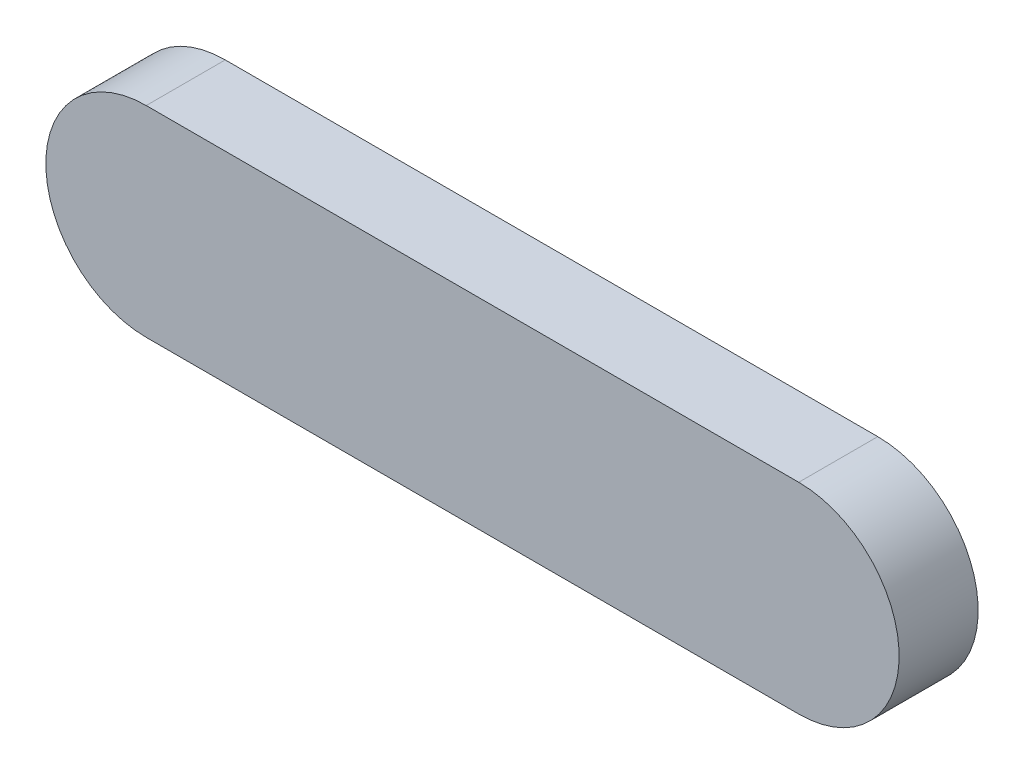
ISO-10303-21;
HEADER;
FILE_DESCRIPTION(('STEP AP214'),'2;1');
FILE_NAME('part.step','',(''),(''),'','','');
FILE_SCHEMA(('AUTOMOTIVE_DESIGN { 1 0 10303 214 1 1 1 1 }'));
ENDSEC;
DATA;
#1=APPLICATION_CONTEXT('core data for automotive mechanical design processes');
#2=APPLICATION_PROTOCOL_DEFINITION('international standard','automotive_design',2000,#1);
#3=PRODUCT_CONTEXT('',#1,'mechanical');
#4=PRODUCT('Part','Part','',(#3));
#5=PRODUCT_RELATED_PRODUCT_CATEGORY('part','',(#4));
#6=PRODUCT_DEFINITION_FORMATION('','',#4);
#7=PRODUCT_DEFINITION_CONTEXT('part definition',#1,'design');
#8=PRODUCT_DEFINITION('design','',#6,#7);
#9=PRODUCT_DEFINITION_SHAPE('','',#8);
#10=(LENGTH_UNIT() NAMED_UNIT(*) SI_UNIT(.MILLI.,.METRE.));
#11=(NAMED_UNIT(*) PLANE_ANGLE_UNIT() SI_UNIT($,.RADIAN.));
#12=(NAMED_UNIT(*) SI_UNIT($,.STERADIAN.) SOLID_ANGLE_UNIT());
#13=UNCERTAINTY_MEASURE_WITH_UNIT(LENGTH_MEASURE(1.E-05),#10,'distance_accuracy_value','');
#14=(GEOMETRIC_REPRESENTATION_CONTEXT(3) GLOBAL_UNCERTAINTY_ASSIGNED_CONTEXT((#13)) GLOBAL_UNIT_ASSIGNED_CONTEXT((#10,
#11,#12)) REPRESENTATION_CONTEXT('',''));
#15=CARTESIAN_POINT('',(0.,0.,0.));
#16=DIRECTION('',(0.,0.,1.));
#17=DIRECTION('',(1.,0.,0.));
#18=AXIS2_PLACEMENT_3D('',#15,#16,#17);
#19=CARTESIAN_POINT('',(111.379,68.834,0.));
#20=DIRECTION('',(0.,1.,0.));
#21=DIRECTION('',(1.,0.,0.));
#22=AXIS2_PLACEMENT_3D('',#19,#20,#21);
#23=PLANE('',#22);
#24=DIRECTION('',(1.,0.,0.));
#25=VECTOR('',#24,1.);
#26=CARTESIAN_POINT('',(111.379,68.834,0.1999996));
#27=LINE('',#26,#25);
#28=CARTESIAN_POINT('',(111.379,68.834,0.1999996));
#29=VERTEX_POINT('',#28);
#30=CARTESIAN_POINT('',(113.03,68.834,0.1999996));
#31=VERTEX_POINT('',#30);
#32=EDGE_CURVE('E11',#29,#31,#27,.T.);
#33=ORIENTED_EDGE('',*,*,#32,.F.);
#34=DIRECTION('',(0.,0.,1.));
#35=VECTOR('',#34,1.);
#36=CARTESIAN_POINT('',(111.379,68.834,0.));
#37=LINE('',#36,#35);
#38=CARTESIAN_POINT('',(111.379,68.834,0.));
#39=VERTEX_POINT('',#38);
#40=EDGE_CURVE('E24',#39,#29,#37,.T.);
#41=ORIENTED_EDGE('',*,*,#40,.F.);
#42=DIRECTION('',(1.,0.,0.));
#43=VECTOR('',#42,1.);
#44=CARTESIAN_POINT('',(111.379,68.834,0.));
#45=LINE('',#44,#43);
#46=CARTESIAN_POINT('',(113.03,68.834,0.));
#47=VERTEX_POINT('',#46);
#48=EDGE_CURVE('E75',#39,#47,#45,.T.);
#49=ORIENTED_EDGE('',*,*,#48,.T.);
#50=DIRECTION('',(0.,0.,1.));
#51=VECTOR('',#50,1.);
#52=CARTESIAN_POINT('',(113.03,68.834,0.));
#53=LINE('',#52,#51);
#54=EDGE_CURVE('E37',#47,#31,#53,.T.);
#55=ORIENTED_EDGE('',*,*,#54,.T.);
#56=EDGE_LOOP('',(#33,#41,#49,#55));
#57=FACE_BOUND('',#56,.T.);
#58=ADVANCED_FACE('F17',(#57),#23,.F.);
#59=CARTESIAN_POINT('',(113.03,69.088,0.));
#60=DIRECTION('',(0.,0.,-1.));
#61=DIRECTION('',(0.,-1.,0.));
#62=AXIS2_PLACEMENT_3D('',#59,#60,#61);
#63=CYLINDRICAL_SURFACE('',#62,0.253999999999995);
#64=CARTESIAN_POINT('',(113.03,69.088,0.1999996));
#65=DIRECTION('',(0.,0.,1.));
#66=DIRECTION('',(0.,-1.,0.));
#67=AXIS2_PLACEMENT_3D('',#64,#65,#66);
#68=CIRCLE('',#67,0.253999999999995);
#69=CARTESIAN_POINT('',(113.03,69.342,0.1999996));
#70=VERTEX_POINT('',#69);
#71=EDGE_CURVE('E83',#31,#70,#68,.T.);
#72=ORIENTED_EDGE('',*,*,#71,.F.);
#73=ORIENTED_EDGE('',*,*,#54,.F.);
#74=CARTESIAN_POINT('',(113.03,69.088,0.));
#75=DIRECTION('',(0.,0.,1.));
#76=DIRECTION('',(0.,-1.,0.));
#77=AXIS2_PLACEMENT_3D('',#74,#75,#76);
#78=CIRCLE('',#77,0.253999999999995);
#79=CARTESIAN_POINT('',(113.03,69.342,0.));
#80=VERTEX_POINT('',#79);
#81=EDGE_CURVE('E81',#47,#80,#78,.T.);
#82=ORIENTED_EDGE('',*,*,#81,.T.);
#83=DIRECTION('',(0.,0.,1.));
#84=VECTOR('',#83,1.);
#85=CARTESIAN_POINT('',(113.03,69.342,0.));
#86=LINE('',#85,#84);
#87=EDGE_CURVE('E67',#80,#70,#86,.T.);
#88=ORIENTED_EDGE('',*,*,#87,.T.);
#89=EDGE_LOOP('',(#72,#73,#82,#88));
#90=FACE_BOUND('',#89,.T.);
#91=ADVANCED_FACE('F89',(#90),#63,.T.);
#92=CARTESIAN_POINT('',(113.03,69.342,0.));
#93=DIRECTION('',(0.,-1.,0.));
#94=DIRECTION('',(-1.,0.,0.));
#95=AXIS2_PLACEMENT_3D('',#92,#93,#94);
#96=PLANE('',#95);
#97=DIRECTION('',(-1.,0.,0.));
#98=VECTOR('',#97,1.);
#99=CARTESIAN_POINT('',(113.03,69.342,0.1999996));
#100=LINE('',#99,#98);
#101=CARTESIAN_POINT('',(111.379,69.342,0.1999996));
#102=VERTEX_POINT('',#101);
#103=EDGE_CURVE('E71',#70,#102,#100,.T.);
#104=ORIENTED_EDGE('',*,*,#103,.F.);
#105=ORIENTED_EDGE('',*,*,#87,.F.);
#106=DIRECTION('',(-1.,0.,0.));
#107=VECTOR('',#106,1.);
#108=CARTESIAN_POINT('',(113.03,69.342,0.));
#109=LINE('',#108,#107);
#110=CARTESIAN_POINT('',(111.379,69.342,0.));
#111=VERTEX_POINT('',#110);
#112=EDGE_CURVE('E63',#80,#111,#109,.T.);
#113=ORIENTED_EDGE('',*,*,#112,.T.);
#114=DIRECTION('',(0.,0.,1.));
#115=VECTOR('',#114,1.);
#116=CARTESIAN_POINT('',(111.379,69.342,0.));
#117=LINE('',#116,#115);
#118=EDGE_CURVE('E53',#111,#102,#117,.T.);
#119=ORIENTED_EDGE('',*,*,#118,.T.);
#120=EDGE_LOOP('',(#104,#105,#113,#119));
#121=FACE_BOUND('',#120,.T.);
#122=ADVANCED_FACE('F66',(#121),#96,.F.);
#123=CARTESIAN_POINT('',(111.379,69.088,0.));
#124=DIRECTION('',(0.,0.,-1.));
#125=DIRECTION('',(0.,1.,0.));
#126=AXIS2_PLACEMENT_3D('',#123,#124,#125);
#127=CYLINDRICAL_SURFACE('',#126,0.254);
#128=CARTESIAN_POINT('',(111.379,69.088,0.1999996));
#129=DIRECTION('',(0.,0.,1.));
#130=DIRECTION('',(0.,1.,0.));
#131=AXIS2_PLACEMENT_3D('',#128,#129,#130);
#132=CIRCLE('',#131,0.254);
#133=EDGE_CURVE('E59',#102,#29,#132,.T.);
#134=ORIENTED_EDGE('',*,*,#133,.F.);
#135=ORIENTED_EDGE('',*,*,#118,.F.);
#136=CARTESIAN_POINT('',(111.379,69.088,0.));
#137=DIRECTION('',(0.,0.,1.));
#138=DIRECTION('',(0.,1.,0.));
#139=AXIS2_PLACEMENT_3D('',#136,#137,#138);
#140=CIRCLE('',#139,0.254);
#141=EDGE_CURVE('E57',#111,#39,#140,.T.);
#142=ORIENTED_EDGE('',*,*,#141,.T.);
#143=ORIENTED_EDGE('',*,*,#40,.T.);
#144=EDGE_LOOP('',(#134,#135,#142,#143));
#145=FACE_BOUND('',#144,.T.);
#146=ADVANCED_FACE('F55',(#145),#127,.T.);
#147=CARTESIAN_POINT('',(111.379,68.834,0.));
#148=DIRECTION('',(0.,0.,-1.));
#149=DIRECTION('',(-1.,0.,0.));
#150=AXIS2_PLACEMENT_3D('',#147,#148,#149);
#151=PLANE('',#150);
#152=ORIENTED_EDGE('',*,*,#141,.F.);
#153=ORIENTED_EDGE('',*,*,#112,.F.);
#154=ORIENTED_EDGE('',*,*,#81,.F.);
#155=ORIENTED_EDGE('',*,*,#48,.F.);
#156=EDGE_LOOP('',(#152,#153,#154,#155));
#157=FACE_BOUND('',#156,.T.);
#158=ADVANCED_FACE('F74',(#157),#151,.T.);
#159=CARTESIAN_POINT('',(111.379,68.834,0.1999996));
#160=DIRECTION('',(0.,0.,-1.));
#161=DIRECTION('',(-1.,0.,0.));
#162=AXIS2_PLACEMENT_3D('',#159,#160,#161);
#163=PLANE('',#162);
#164=ORIENTED_EDGE('',*,*,#32,.T.);
#165=ORIENTED_EDGE('',*,*,#71,.T.);
#166=ORIENTED_EDGE('',*,*,#103,.T.);
#167=ORIENTED_EDGE('',*,*,#133,.T.);
#168=EDGE_LOOP('',(#164,#165,#166,#167));
#169=FACE_BOUND('',#168,.T.);
#170=ADVANCED_FACE('F91',(#169),#163,.F.);
#171=CLOSED_SHELL('',(#58,#91,#122,#146,#158,#170));
#172=MANIFOLD_SOLID_BREP('B1',#171);
#173=ADVANCED_BREP_SHAPE_REPRESENTATION('',(#18,#172),#14);
#174=SHAPE_DEFINITION_REPRESENTATION(#9,#173);
ENDSEC;
END-ISO-10303-21;
